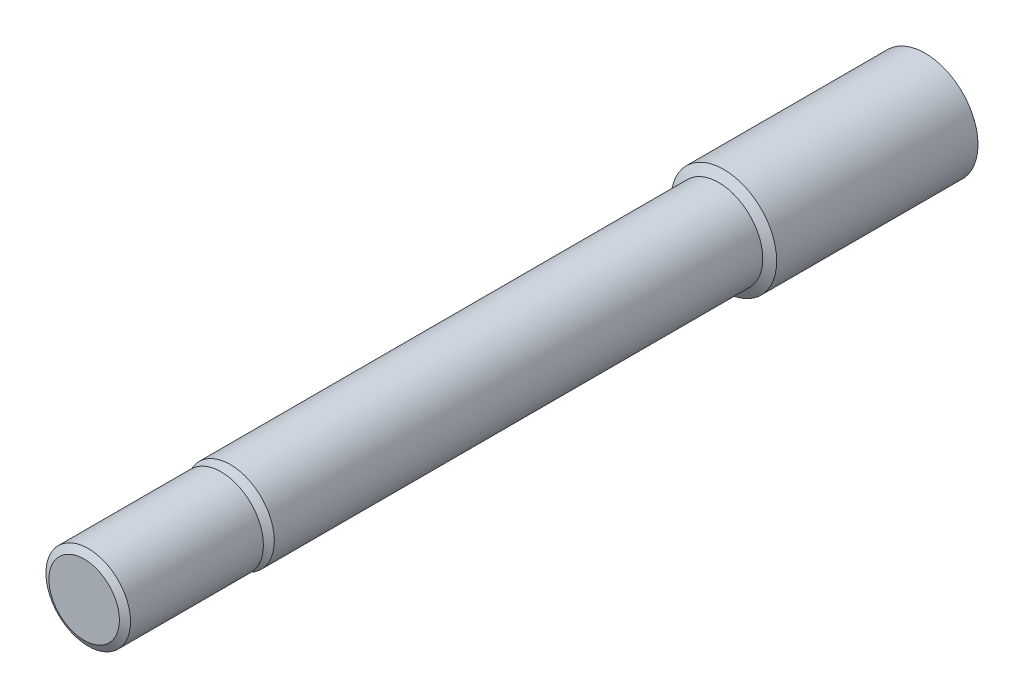
ISO-10303-21;
HEADER;
FILE_DESCRIPTION(('STEP AP214'),'2;1');
FILE_NAME('part.step','',(''),(''),'','','');
FILE_SCHEMA(('AUTOMOTIVE_DESIGN { 1 0 10303 214 1 1 1 1 }'));
ENDSEC;
DATA;
#1=APPLICATION_CONTEXT('core data for automotive mechanical design processes');
#2=APPLICATION_PROTOCOL_DEFINITION('international standard','automotive_design',2000,#1);
#3=PRODUCT_CONTEXT('',#1,'mechanical');
#4=PRODUCT('Part','Part','',(#3));
#5=PRODUCT_RELATED_PRODUCT_CATEGORY('part','',(#4));
#6=PRODUCT_DEFINITION_FORMATION('','',#4);
#7=PRODUCT_DEFINITION_CONTEXT('part definition',#1,'design');
#8=PRODUCT_DEFINITION('design','',#6,#7);
#9=PRODUCT_DEFINITION_SHAPE('','',#8);
#10=(LENGTH_UNIT() NAMED_UNIT(*) SI_UNIT(.MILLI.,.METRE.));
#11=(NAMED_UNIT(*) PLANE_ANGLE_UNIT() SI_UNIT($,.RADIAN.));
#12=(NAMED_UNIT(*) SI_UNIT($,.STERADIAN.) SOLID_ANGLE_UNIT());
#13=UNCERTAINTY_MEASURE_WITH_UNIT(LENGTH_MEASURE(1.E-05),#10,'distance_accuracy_value','');
#14=(GEOMETRIC_REPRESENTATION_CONTEXT(3) GLOBAL_UNCERTAINTY_ASSIGNED_CONTEXT((#13)) GLOBAL_UNIT_ASSIGNED_CONTEXT((#10,
#11,#12)) REPRESENTATION_CONTEXT('',''));
#15=CARTESIAN_POINT('',(0.,0.,0.));
#16=DIRECTION('',(0.,0.,1.));
#17=DIRECTION('',(1.,0.,0.));
#18=AXIS2_PLACEMENT_3D('',#15,#16,#17);
#19=CARTESIAN_POINT('',(0.,0.,0.));
#20=DIRECTION('',(0.,0.,-1.));
#21=DIRECTION('',(-1.,0.,0.));
#22=AXIS2_PLACEMENT_3D('',#19,#20,#21);
#23=PLANE('',#22);
#24=CARTESIAN_POINT('',(0.,0.,0.));
#25=DIRECTION('',(0.,0.,1.));
#26=DIRECTION('',(1.,0.,0.));
#27=AXIS2_PLACEMENT_3D('',#24,#25,#26);
#28=CIRCLE('',#27,1.);
#29=CARTESIAN_POINT('',(1.,0.,0.));
#30=VERTEX_POINT('',#29);
#31=EDGE_CURVE('E10',#30,#30,#28,.T.);
#32=ORIENTED_EDGE('',*,*,#31,.T.);
#33=EDGE_LOOP('',(#32));
#34=FACE_BOUND('',#33,.T.);
#35=ADVANCED_FACE('F33',(#34),#23,.F.);
#36=CARTESIAN_POINT('',(0.,0.,-0.115470053837924));
#37=DIRECTION('',(0.,0.,-1.));
#38=DIRECTION('',(-1.,0.,0.));
#39=AXIS2_PLACEMENT_3D('',#36,#37,#38);
#40=CONICAL_SURFACE('',#39,1.2,1.0471975511966);
#41=ORIENTED_EDGE('',*,*,#31,.F.);
#42=EDGE_LOOP('',(#41));
#43=FACE_BOUND('',#42,.T.);
#44=CARTESIAN_POINT('',(0.,0.,-0.115470053837924));
#45=DIRECTION('',(0.,0.,1.));
#46=DIRECTION('',(1.,0.,0.));
#47=AXIS2_PLACEMENT_3D('',#44,#45,#46);
#48=CIRCLE('',#47,1.2);
#49=CARTESIAN_POINT('',(1.2,0.,-0.115470053837924));
#50=VERTEX_POINT('',#49);
#51=EDGE_CURVE('E39',#50,#50,#48,.T.);
#52=ORIENTED_EDGE('',*,*,#51,.T.);
#53=EDGE_LOOP('',(#52));
#54=FACE_BOUND('',#53,.T.);
#55=ADVANCED_FACE('F80',(#43,#54),#40,.T.);
#56=CARTESIAN_POINT('',(0.,0.,0.));
#57=DIRECTION('',(0.,0.,1.));
#58=DIRECTION('',(1.,0.,0.));
#59=AXIS2_PLACEMENT_3D('',#56,#57,#58);
#60=CYLINDRICAL_SURFACE('',#59,1.2);
#61=ORIENTED_EDGE('',*,*,#51,.F.);
#62=EDGE_LOOP('',(#61));
#63=FACE_BOUND('',#62,.T.);
#64=CARTESIAN_POINT('',(0.,0.,-3.88452994616208));
#65=DIRECTION('',(0.,0.,1.));
#66=DIRECTION('',(1.,0.,0.));
#67=AXIS2_PLACEMENT_3D('',#64,#65,#66);
#68=CIRCLE('',#67,1.2);
#69=CARTESIAN_POINT('',(1.2,0.,-3.88452994616208));
#70=VERTEX_POINT('',#69);
#71=EDGE_CURVE('E43',#70,#70,#68,.T.);
#72=ORIENTED_EDGE('',*,*,#71,.T.);
#73=EDGE_LOOP('',(#72));
#74=FACE_BOUND('',#73,.T.);
#75=ADVANCED_FACE('F84',(#63,#74),#60,.T.);
#76=CARTESIAN_POINT('',(0.,0.,-4.));
#77=DIRECTION('',(0.,0.,1.));
#78=DIRECTION('',(1.,0.,0.));
#79=AXIS2_PLACEMENT_3D('',#76,#77,#78);
#80=CONICAL_SURFACE('',#79,1.,1.0471975511966);
#81=ORIENTED_EDGE('',*,*,#71,.F.);
#82=EDGE_LOOP('',(#81));
#83=FACE_BOUND('',#82,.T.);
#84=CARTESIAN_POINT('',(0.,0.,-4.));
#85=DIRECTION('',(0.,0.,1.));
#86=DIRECTION('',(1.,0.,0.));
#87=AXIS2_PLACEMENT_3D('',#84,#85,#86);
#88=CIRCLE('',#87,1.);
#89=CARTESIAN_POINT('',(1.,0.,-4.));
#90=VERTEX_POINT('',#89);
#91=EDGE_CURVE('E47',#90,#90,#88,.T.);
#92=ORIENTED_EDGE('',*,*,#91,.T.);
#93=EDGE_LOOP('',(#92));
#94=FACE_BOUND('',#93,.T.);
#95=ADVANCED_FACE('F89',(#83,#94),#80,.T.);
#96=CARTESIAN_POINT('',(0.,0.,-4.14433756729741));
#97=DIRECTION('',(0.,0.,-1.));
#98=DIRECTION('',(-1.,0.,0.));
#99=AXIS2_PLACEMENT_3D('',#96,#97,#98);
#100=CONICAL_SURFACE('',#99,1.25,1.0471975511966);
#101=ORIENTED_EDGE('',*,*,#91,.F.);
#102=EDGE_LOOP('',(#101));
#103=FACE_BOUND('',#102,.T.);
#104=CARTESIAN_POINT('',(0.,0.,-4.14433756729741));
#105=DIRECTION('',(0.,0.,1.));
#106=DIRECTION('',(1.,0.,0.));
#107=AXIS2_PLACEMENT_3D('',#104,#105,#106);
#108=CIRCLE('',#107,1.25);
#109=CARTESIAN_POINT('',(1.25,0.,-4.14433756729741));
#110=VERTEX_POINT('',#109);
#111=EDGE_CURVE('E52',#110,#110,#108,.T.);
#112=ORIENTED_EDGE('',*,*,#111,.T.);
#113=EDGE_LOOP('',(#112));
#114=FACE_BOUND('',#113,.T.);
#115=ADVANCED_FACE('F95',(#103,#114),#100,.T.);
#116=CARTESIAN_POINT('',(0.,0.,0.));
#117=DIRECTION('',(0.,0.,1.));
#118=DIRECTION('',(1.,0.,0.));
#119=AXIS2_PLACEMENT_3D('',#116,#117,#118);
#120=CYLINDRICAL_SURFACE('',#119,1.25);
#121=ORIENTED_EDGE('',*,*,#111,.F.);
#122=EDGE_LOOP('',(#121));
#123=FACE_BOUND('',#122,.T.);
#124=CARTESIAN_POINT('',(0.,0.,-18.));
#125=DIRECTION('',(0.,0.,1.));
#126=DIRECTION('',(1.,0.,0.));
#127=AXIS2_PLACEMENT_3D('',#124,#125,#126);
#128=CIRCLE('',#127,1.25);
#129=CARTESIAN_POINT('',(1.25,0.,-18.));
#130=VERTEX_POINT('',#129);
#131=EDGE_CURVE('E55',#130,#130,#128,.T.);
#132=ORIENTED_EDGE('',*,*,#131,.T.);
#133=EDGE_LOOP('',(#132));
#134=FACE_BOUND('',#133,.T.);
#135=ADVANCED_FACE('F99',(#123,#134),#120,.T.);
#136=CARTESIAN_POINT('',(0.,0.,-18.1443375672974));
#137=DIRECTION('',(0.,0.,-1.));
#138=DIRECTION('',(-1.,0.,0.));
#139=AXIS2_PLACEMENT_3D('',#136,#137,#138);
#140=CONICAL_SURFACE('',#139,1.5,1.0471975511966);
#141=ORIENTED_EDGE('',*,*,#131,.F.);
#142=EDGE_LOOP('',(#141));
#143=FACE_BOUND('',#142,.T.);
#144=CARTESIAN_POINT('',(0.,0.,-18.1443375672974));
#145=DIRECTION('',(0.,0.,1.));
#146=DIRECTION('',(1.,0.,0.));
#147=AXIS2_PLACEMENT_3D('',#144,#145,#146);
#148=CIRCLE('',#147,1.5);
#149=CARTESIAN_POINT('',(1.5,0.,-18.1443375672974));
#150=VERTEX_POINT('',#149);
#151=EDGE_CURVE('E58',#150,#150,#148,.T.);
#152=ORIENTED_EDGE('',*,*,#151,.T.);
#153=EDGE_LOOP('',(#152));
#154=FACE_BOUND('',#153,.T.);
#155=ADVANCED_FACE('F103',(#143,#154),#140,.T.);
#156=CARTESIAN_POINT('',(0.,0.,0.));
#157=DIRECTION('',(0.,0.,1.));
#158=DIRECTION('',(1.,0.,0.));
#159=AXIS2_PLACEMENT_3D('',#156,#157,#158);
#160=CYLINDRICAL_SURFACE('',#159,1.5);
#161=ORIENTED_EDGE('',*,*,#151,.F.);
#162=EDGE_LOOP('',(#161));
#163=FACE_BOUND('',#162,.T.);
#164=CARTESIAN_POINT('',(0.,0.,-23.8556624327026));
#165=DIRECTION('',(0.,0.,1.));
#166=DIRECTION('',(1.,0.,0.));
#167=AXIS2_PLACEMENT_3D('',#164,#165,#166);
#168=CIRCLE('',#167,1.5);
#169=CARTESIAN_POINT('',(1.5,0.,-23.8556624327026));
#170=VERTEX_POINT('',#169);
#171=EDGE_CURVE('E61',#170,#170,#168,.T.);
#172=ORIENTED_EDGE('',*,*,#171,.T.);
#173=EDGE_LOOP('',(#172));
#174=FACE_BOUND('',#173,.T.);
#175=ADVANCED_FACE('F76',(#163,#174),#160,.T.);
#176=CARTESIAN_POINT('',(0.,0.,-24.));
#177=DIRECTION('',(0.,0.,1.));
#178=DIRECTION('',(1.,0.,0.));
#179=AXIS2_PLACEMENT_3D('',#176,#177,#178);
#180=CONICAL_SURFACE('',#179,1.25,1.04719755119659);
#181=ORIENTED_EDGE('',*,*,#171,.F.);
#182=EDGE_LOOP('',(#181));
#183=FACE_BOUND('',#182,.T.);
#184=CARTESIAN_POINT('',(0.,0.,-24.));
#185=DIRECTION('',(0.,0.,1.));
#186=DIRECTION('',(1.,0.,0.));
#187=AXIS2_PLACEMENT_3D('',#184,#185,#186);
#188=CIRCLE('',#187,1.25);
#189=CARTESIAN_POINT('',(1.25,0.,-24.));
#190=VERTEX_POINT('',#189);
#191=EDGE_CURVE('E64',#190,#190,#188,.T.);
#192=ORIENTED_EDGE('',*,*,#191,.T.);
#193=EDGE_LOOP('',(#192));
#194=FACE_BOUND('',#193,.T.);
#195=ADVANCED_FACE('F68',(#183,#194),#180,.T.);
#196=CARTESIAN_POINT('',(0.,1.25,-24.));
#197=DIRECTION('',(0.,0.,1.));
#198=DIRECTION('',(1.,0.,0.));
#199=AXIS2_PLACEMENT_3D('',#196,#197,#198);
#200=PLANE('',#199);
#201=ORIENTED_EDGE('',*,*,#191,.F.);
#202=EDGE_LOOP('',(#201));
#203=FACE_BOUND('',#202,.T.);
#204=ADVANCED_FACE('F70',(#203),#200,.F.);
#205=CLOSED_SHELL('',(#35,#55,#75,#95,#115,#135,#155,#175,#195,#204));
#206=MANIFOLD_SOLID_BREP('B2',#205);
#207=ADVANCED_BREP_SHAPE_REPRESENTATION('',(#18,#206),#14);
#208=SHAPE_DEFINITION_REPRESENTATION(#9,#207);
ENDSEC;
END-ISO-10303-21;
